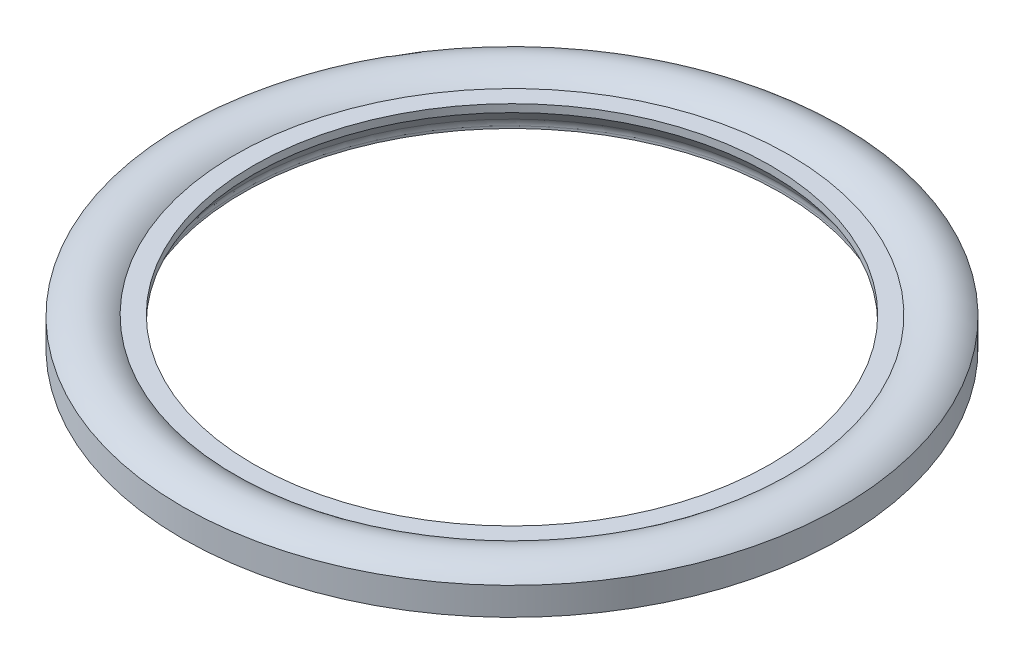
ISO-10303-21;
HEADER;
FILE_DESCRIPTION(('STEP AP214'),'2;1');
FILE_NAME('part.step','',(''),(''),'','','');
FILE_SCHEMA(('AUTOMOTIVE_DESIGN { 1 0 10303 214 1 1 1 1 }'));
ENDSEC;
DATA;
#1=APPLICATION_CONTEXT('core data for automotive mechanical design processes');
#2=APPLICATION_PROTOCOL_DEFINITION('international standard','automotive_design',2000,#1);
#3=PRODUCT_CONTEXT('',#1,'mechanical');
#4=PRODUCT('Part','Part','',(#3));
#5=PRODUCT_RELATED_PRODUCT_CATEGORY('part','',(#4));
#6=PRODUCT_DEFINITION_FORMATION('','',#4);
#7=PRODUCT_DEFINITION_CONTEXT('part definition',#1,'design');
#8=PRODUCT_DEFINITION('design','',#6,#7);
#9=PRODUCT_DEFINITION_SHAPE('','',#8);
#10=(LENGTH_UNIT() NAMED_UNIT(*) SI_UNIT(.MILLI.,.METRE.));
#11=(NAMED_UNIT(*) PLANE_ANGLE_UNIT() SI_UNIT($,.RADIAN.));
#12=(NAMED_UNIT(*) SI_UNIT($,.STERADIAN.) SOLID_ANGLE_UNIT());
#13=UNCERTAINTY_MEASURE_WITH_UNIT(LENGTH_MEASURE(1.E-05),#10,'distance_accuracy_value','');
#14=(GEOMETRIC_REPRESENTATION_CONTEXT(3) GLOBAL_UNCERTAINTY_ASSIGNED_CONTEXT((#13)) GLOBAL_UNIT_ASSIGNED_CONTEXT((#10,
#11,#12)) REPRESENTATION_CONTEXT('',''));
#15=CARTESIAN_POINT('',(0.,0.,0.));
#16=DIRECTION('',(0.,0.,1.));
#17=DIRECTION('',(1.,0.,0.));
#18=AXIS2_PLACEMENT_3D('',#15,#16,#17);
#19=CARTESIAN_POINT('',(0.,-31.9187707641196,0.));
#20=DIRECTION('',(0.,-1.,0.));
#21=DIRECTION('',(0.,0.,-1.));
#22=AXIS2_PLACEMENT_3D('',#19,#20,#21);
#23=CYLINDRICAL_SURFACE('',#22,41.75);
#24=CARTESIAN_POINT('',(0.,0.356804883704688,0.));
#25=DIRECTION('',(0.,-1.,0.));
#26=DIRECTION('',(0.,0.,-1.));
#27=AXIS2_PLACEMENT_3D('',#24,#25,#26);
#28=CIRCLE('',#27,41.75);
#29=CARTESIAN_POINT('',(0.,0.356804883704688,-41.75));
#30=VERTEX_POINT('',#29);
#31=EDGE_CURVE('E10',#30,#30,#28,.F.);
#32=ORIENTED_EDGE('',*,*,#31,.T.);
#33=EDGE_LOOP('',(#32));
#34=FACE_BOUND('',#33,.T.);
#35=CARTESIAN_POINT('',(0.,0.,0.));
#36=DIRECTION('',(0.,-1.,0.));
#37=DIRECTION('',(0.,0.,-1.));
#38=AXIS2_PLACEMENT_3D('',#35,#36,#37);
#39=CIRCLE('',#38,41.75);
#40=CARTESIAN_POINT('',(0.,0.,-41.75));
#41=VERTEX_POINT('',#40);
#42=EDGE_CURVE('E42',#41,#41,#39,.T.);
#43=ORIENTED_EDGE('',*,*,#42,.T.);
#44=EDGE_LOOP('',(#43));
#45=FACE_BOUND('',#44,.T.);
#46=ADVANCED_FACE('F31',(#34,#45),#23,.F.);
#47=CARTESIAN_POINT('',(41.75,0.,0.));
#48=DIRECTION('',(0.,-1.,0.));
#49=DIRECTION('',(0.,0.,-1.));
#50=AXIS2_PLACEMENT_3D('',#47,#48,#49);
#51=PLANE('',#50);
#52=CARTESIAN_POINT('',(0.,0.,0.));
#53=DIRECTION('',(0.,-1.,0.));
#54=DIRECTION('',(0.,0.,-1.));
#55=AXIS2_PLACEMENT_3D('',#52,#53,#54);
#56=CIRCLE('',#55,51.1);
#57=CARTESIAN_POINT('',(0.,0.,-51.1));
#58=VERTEX_POINT('',#57);
#59=EDGE_CURVE('E46',#58,#58,#56,.T.);
#60=ORIENTED_EDGE('',*,*,#59,.T.);
#61=EDGE_LOOP('',(#60));
#62=FACE_BOUND('',#61,.T.);
#63=ORIENTED_EDGE('',*,*,#42,.F.);
#64=EDGE_LOOP('',(#63));
#65=FACE_BOUND('',#64,.T.);
#66=ADVANCED_FACE('F78',(#62,#65),#51,.T.);
#67=CARTESIAN_POINT('',(0.,-31.9187707641196,0.));
#68=DIRECTION('',(0.,-1.,0.));
#69=DIRECTION('',(0.,0.,-1.));
#70=AXIS2_PLACEMENT_3D('',#67,#68,#69);
#71=CYLINDRICAL_SURFACE('',#70,51.1);
#72=CARTESIAN_POINT('',(0.,4.3,0.));
#73=DIRECTION('',(0.,-1.,0.));
#74=DIRECTION('',(0.,0.,-1.));
#75=AXIS2_PLACEMENT_3D('',#72,#73,#74);
#76=CIRCLE('',#75,51.1);
#77=CARTESIAN_POINT('',(0.,4.3,-51.1));
#78=VERTEX_POINT('',#77);
#79=EDGE_CURVE('E51',#78,#78,#76,.T.);
#80=ORIENTED_EDGE('',*,*,#79,.T.);
#81=EDGE_LOOP('',(#80));
#82=FACE_BOUND('',#81,.T.);
#83=ORIENTED_EDGE('',*,*,#59,.F.);
#84=EDGE_LOOP('',(#83));
#85=FACE_BOUND('',#84,.T.);
#86=ADVANCED_FACE('F82',(#82,#85),#71,.T.);
#87=CARTESIAN_POINT('',(0.,-0.0109038950620423,0.));
#88=DIRECTION('',(0.,-1.,0.));
#89=DIRECTION('',(0.,0.,-1.));
#90=AXIS2_PLACEMENT_3D('',#87,#88,#89);
#91=TOROIDAL_SURFACE('',#90,46.9267389720341,6.);
#92=CARTESIAN_POINT('',(0.,4.49999999999999,0.));
#93=DIRECTION('',(0.,-1.,0.));
#94=DIRECTION('',(0.,0.,-1.));
#95=AXIS2_PLACEMENT_3D('',#92,#93,#94);
#96=CIRCLE('',#95,42.9705102059598);
#97=CARTESIAN_POINT('',(0.,4.49999999999999,-42.9705102059598));
#98=VERTEX_POINT('',#97);
#99=EDGE_CURVE('E54',#98,#98,#96,.T.);
#100=ORIENTED_EDGE('',*,*,#99,.T.);
#101=EDGE_LOOP('',(#100));
#102=FACE_BOUND('',#101,.T.);
#103=ORIENTED_EDGE('',*,*,#79,.F.);
#104=EDGE_LOOP('',(#103));
#105=FACE_BOUND('',#104,.T.);
#106=ADVANCED_FACE('F89',(#102,#105),#91,.T.);
#107=CARTESIAN_POINT('',(42.9705102059598,4.5,0.));
#108=DIRECTION('',(0.,1.,0.));
#109=DIRECTION('',(0.,0.,1.));
#110=AXIS2_PLACEMENT_3D('',#107,#108,#109);
#111=PLANE('',#110);
#112=CARTESIAN_POINT('',(0.,4.5,0.));
#113=DIRECTION('',(0.,-1.,0.));
#114=DIRECTION('',(0.,0.,-1.));
#115=AXIS2_PLACEMENT_3D('',#112,#113,#114);
#116=CIRCLE('',#115,40.1);
#117=CARTESIAN_POINT('',(0.,4.5,-40.1));
#118=VERTEX_POINT('',#117);
#119=EDGE_CURVE('E57',#118,#118,#116,.T.);
#120=ORIENTED_EDGE('',*,*,#119,.T.);
#121=EDGE_LOOP('',(#120));
#122=FACE_BOUND('',#121,.T.);
#123=ORIENTED_EDGE('',*,*,#99,.F.);
#124=EDGE_LOOP('',(#123));
#125=FACE_BOUND('',#124,.T.);
#126=ADVANCED_FACE('F75',(#122,#125),#111,.T.);
#127=CARTESIAN_POINT('',(0.,-31.9187707641196,0.));
#128=DIRECTION('',(0.,-1.,0.));
#129=DIRECTION('',(0.,0.,-1.));
#130=AXIS2_PLACEMENT_3D('',#127,#128,#129);
#131=CYLINDRICAL_SURFACE('',#130,40.1);
#132=CARTESIAN_POINT('',(0.,3.3,0.));
#133=DIRECTION('',(0.,-1.,0.));
#134=DIRECTION('',(0.,0.,-1.));
#135=AXIS2_PLACEMENT_3D('',#132,#133,#134);
#136=CIRCLE('',#135,40.1);
#137=CARTESIAN_POINT('',(0.,3.3,-40.1));
#138=VERTEX_POINT('',#137);
#139=EDGE_CURVE('E60',#138,#138,#136,.T.);
#140=ORIENTED_EDGE('',*,*,#139,.T.);
#141=EDGE_LOOP('',(#140));
#142=FACE_BOUND('',#141,.T.);
#143=ORIENTED_EDGE('',*,*,#119,.F.);
#144=EDGE_LOOP('',(#143));
#145=FACE_BOUND('',#144,.T.);
#146=ADVANCED_FACE('F64',(#142,#145),#131,.F.);
#147=CARTESIAN_POINT('',(0.,3.3,0.));
#148=DIRECTION('',(0.,-1.,0.));
#149=DIRECTION('',(0.,0.,-1.));
#150=AXIS2_PLACEMENT_3D('',#147,#148,#149);
#151=CONICAL_SURFACE('',#150,40.1,0.622302871187208);
#152=CARTESIAN_POINT('',(0.,1.52262063460815,0.));
#153=DIRECTION('',(0.,-1.,0.));
#154=DIRECTION('',(0.,0.,-1.));
#155=AXIS2_PLACEMENT_3D('',#152,#153,#154);
#156=CIRCLE('',#155,41.3750765012594);
#157=CARTESIAN_POINT('',(0.,1.52262063460815,-41.3750765012594));
#158=VERTEX_POINT('',#157);
#159=EDGE_CURVE('E38',#158,#158,#156,.T.);
#160=ORIENTED_EDGE('',*,*,#159,.T.);
#161=EDGE_LOOP('',(#160));
#162=FACE_BOUND('',#161,.T.);
#163=ORIENTED_EDGE('',*,*,#139,.F.);
#164=EDGE_LOOP('',(#163));
#165=FACE_BOUND('',#164,.T.);
#166=ADVANCED_FACE('F67',(#162,#165),#151,.F.);
#167=CARTESIAN_POINT('',(0.,0.356804883704688,0.));
#168=DIRECTION('',(0.,-1.,0.));
#169=DIRECTION('',(0.,0.,-1.));
#170=AXIS2_PLACEMENT_3D('',#167,#168,#169);
#171=TOROIDAL_SURFACE('',#170,39.75,2.);
#172=ORIENTED_EDGE('',*,*,#31,.F.);
#173=EDGE_LOOP('',(#172));
#174=FACE_BOUND('',#173,.T.);
#175=ORIENTED_EDGE('',*,*,#159,.F.);
#176=EDGE_LOOP('',(#175));
#177=FACE_BOUND('',#176,.T.);
#178=ADVANCED_FACE('F33',(#174,#177),#171,.F.);
#179=CLOSED_SHELL('',(#46,#66,#86,#106,#126,#146,#166,#178));
#180=MANIFOLD_SOLID_BREP('B2',#179);
#181=ADVANCED_BREP_SHAPE_REPRESENTATION('',(#18,#180),#14);
#182=SHAPE_DEFINITION_REPRESENTATION(#9,#181);
ENDSEC;
END-ISO-10303-21;
